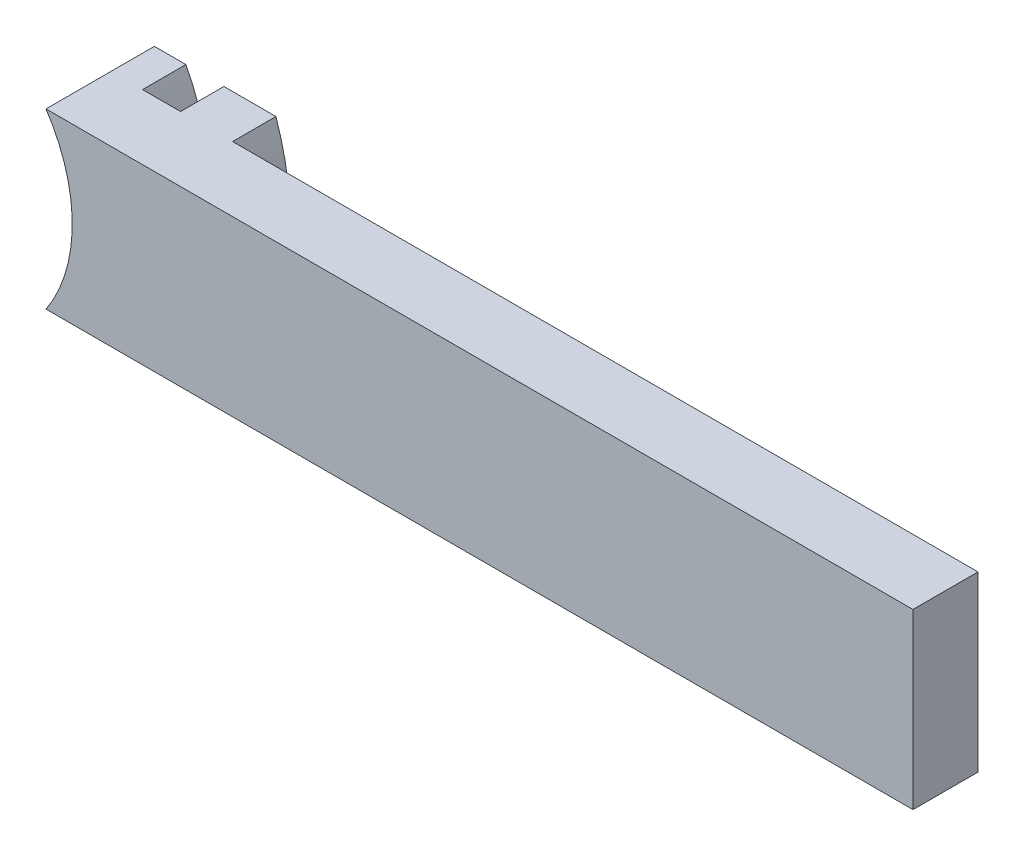
ISO-10303-21;
HEADER;
FILE_DESCRIPTION(('STEP AP214'),'2;1');
FILE_NAME('part.step','',(''),(''),'','','');
FILE_SCHEMA(('AUTOMOTIVE_DESIGN { 1 0 10303 214 1 1 1 1 }'));
ENDSEC;
DATA;
#1=APPLICATION_CONTEXT('core data for automotive mechanical design processes');
#2=APPLICATION_PROTOCOL_DEFINITION('international standard','automotive_design',2000,#1);
#3=PRODUCT_CONTEXT('',#1,'mechanical');
#4=PRODUCT('Part','Part','',(#3));
#5=PRODUCT_RELATED_PRODUCT_CATEGORY('part','',(#4));
#6=PRODUCT_DEFINITION_FORMATION('','',#4);
#7=PRODUCT_DEFINITION_CONTEXT('part definition',#1,'design');
#8=PRODUCT_DEFINITION('design','',#6,#7);
#9=PRODUCT_DEFINITION_SHAPE('','',#8);
#10=(LENGTH_UNIT() NAMED_UNIT(*) SI_UNIT(.MILLI.,.METRE.));
#11=(NAMED_UNIT(*) PLANE_ANGLE_UNIT() SI_UNIT($,.RADIAN.));
#12=(NAMED_UNIT(*) SI_UNIT($,.STERADIAN.) SOLID_ANGLE_UNIT());
#13=UNCERTAINTY_MEASURE_WITH_UNIT(LENGTH_MEASURE(1.E-05),#10,'distance_accuracy_value','');
#14=(GEOMETRIC_REPRESENTATION_CONTEXT(3) GLOBAL_UNCERTAINTY_ASSIGNED_CONTEXT((#13)) GLOBAL_UNIT_ASSIGNED_CONTEXT((#10,
#11,#12)) REPRESENTATION_CONTEXT('',''));
#15=CARTESIAN_POINT('',(0.,0.,0.));
#16=DIRECTION('',(0.,0.,1.));
#17=DIRECTION('',(1.,0.,0.));
#18=AXIS2_PLACEMENT_3D('',#15,#16,#17);
#19=CARTESIAN_POINT('',(0.,0.,-15.));
#20=DIRECTION('',(0.,0.,-1.));
#21=DIRECTION('',(-1.,0.,0.));
#22=AXIS2_PLACEMENT_3D('',#19,#20,#21);
#23=PLANE('',#22);
#24=CARTESIAN_POINT('',(0.,0.,-15.));
#25=DIRECTION('',(0.,0.,-1.));
#26=DIRECTION('',(1.,0.,0.));
#27=AXIS2_PLACEMENT_3D('',#24,#25,#26);
#28=CIRCLE('',#27,42.3);
#29=CARTESIAN_POINT('',(37.2731807067763,20.,-15.));
#30=VERTEX_POINT('',#29);
#31=CARTESIAN_POINT('',(37.2731807067763,-19.9999999999999,-15.));
#32=VERTEX_POINT('',#31);
#33=EDGE_CURVE('E61',#30,#32,#28,.T.);
#34=ORIENTED_EDGE('',*,*,#33,.F.);
#35=DIRECTION('',(-1.,0.,0.));
#36=VECTOR('',#35,1.);
#37=CARTESIAN_POINT('',(30.,20.,-15.));
#38=LINE('',#37,#36);
#39=CARTESIAN_POINT('',(46.0438921030792,20.,-15.));
#40=VERTEX_POINT('',#39);
#41=EDGE_CURVE('E178',#40,#30,#38,.T.);
#42=ORIENTED_EDGE('',*,*,#41,.F.);
#43=CARTESIAN_POINT('',(0.,0.,-15.));
#44=DIRECTION('',(0.,0.,1.));
#45=DIRECTION('',(1.,0.,0.));
#46=AXIS2_PLACEMENT_3D('',#43,#44,#45);
#47=CIRCLE('',#46,50.2);
#48=CARTESIAN_POINT('',(46.0438921030792,-20.,-15.));
#49=VERTEX_POINT('',#48);
#50=EDGE_CURVE('E56',#49,#40,#47,.T.);
#51=ORIENTED_EDGE('',*,*,#50,.F.);
#52=DIRECTION('',(1.,0.,0.));
#53=VECTOR('',#52,1.);
#54=CARTESIAN_POINT('',(30.,-20.,-15.));
#55=LINE('',#54,#53);
#56=EDGE_CURVE('E173',#32,#49,#55,.T.);
#57=ORIENTED_EDGE('',*,*,#56,.F.);
#58=EDGE_LOOP('',(#34,#42,#51,#57));
#59=FACE_BOUND('',#58,.T.);
#60=ADVANCED_FACE('F39',(#59),#23,.T.);
#61=CARTESIAN_POINT('',(0.,0.,-15.));
#62=DIRECTION('',(0.,0.,1.));
#63=DIRECTION('',(1.,0.,0.));
#64=AXIS2_PLACEMENT_3D('',#61,#62,#63);
#65=CYLINDRICAL_SURFACE('',#64,36.0555127546399);
#66=CARTESIAN_POINT('',(0.,0.,0.));
#67=DIRECTION('',(0.,0.,-1.));
#68=DIRECTION('',(-1.,0.,0.));
#69=AXIS2_PLACEMENT_3D('',#66,#67,#68);
#70=CIRCLE('',#69,36.0555127546399);
#71=CARTESIAN_POINT('',(30.,20.,0.));
#72=VERTEX_POINT('',#71);
#73=CARTESIAN_POINT('',(30.,-20.,0.));
#74=VERTEX_POINT('',#73);
#75=EDGE_CURVE('E120',#72,#74,#70,.T.);
#76=ORIENTED_EDGE('',*,*,#75,.F.);
#77=DIRECTION('',(0.,0.,1.));
#78=VECTOR('',#77,1.);
#79=CARTESIAN_POINT('',(30.,20.,-15.));
#80=LINE('',#79,#78);
#81=CARTESIAN_POINT('',(30.,20.,-25.));
#82=VERTEX_POINT('',#81);
#83=EDGE_CURVE('E11',#82,#72,#80,.T.);
#84=ORIENTED_EDGE('',*,*,#83,.F.);
#85=CARTESIAN_POINT('',(0.,0.,-25.));
#86=DIRECTION('',(0.,0.,1.));
#87=DIRECTION('',(-1.,0.,0.));
#88=AXIS2_PLACEMENT_3D('',#85,#86,#87);
#89=CIRCLE('',#88,36.0555127546399);
#90=CARTESIAN_POINT('',(30.0000000000001,-19.9999999999999,-25.));
#91=VERTEX_POINT('',#90);
#92=EDGE_CURVE('E118',#91,#82,#89,.T.);
#93=ORIENTED_EDGE('',*,*,#92,.F.);
#94=DIRECTION('',(0.,0.,1.));
#95=VECTOR('',#94,1.);
#96=CARTESIAN_POINT('',(30.,-20.,-15.));
#97=LINE('',#96,#95);
#98=EDGE_CURVE('E43',#91,#74,#97,.T.);
#99=ORIENTED_EDGE('',*,*,#98,.T.);
#100=EDGE_LOOP('',(#76,#84,#93,#99));
#101=FACE_BOUND('',#100,.T.);
#102=ADVANCED_FACE('F41',(#101),#65,.F.);
#103=CARTESIAN_POINT('',(30.,20.,-15.));
#104=DIRECTION('',(0.,1.,0.));
#105=DIRECTION('',(-1.,0.,0.));
#106=AXIS2_PLACEMENT_3D('',#103,#104,#105);
#107=PLANE('',#106);
#108=DIRECTION('',(-1.,0.,0.));
#109=VECTOR('',#108,1.);
#110=CARTESIAN_POINT('',(30.,20.,0.));
#111=LINE('',#110,#109);
#112=CARTESIAN_POINT('',(230.,20.,0.));
#113=VERTEX_POINT('',#112);
#114=EDGE_CURVE('E174',#113,#72,#111,.T.);
#115=ORIENTED_EDGE('',*,*,#114,.F.);
#116=DIRECTION('',(0.,0.,1.));
#117=VECTOR('',#116,1.);
#118=CARTESIAN_POINT('',(230.,20.,-15.));
#119=LINE('',#118,#117);
#120=CARTESIAN_POINT('',(230.,20.,-15.));
#121=VERTEX_POINT('',#120);
#122=EDGE_CURVE('E48',#121,#113,#119,.T.);
#123=ORIENTED_EDGE('',*,*,#122,.F.);
#124=CARTESIAN_POINT('',(58.0438921030792,20.,-15.));
#125=VERTEX_POINT('',#124);
#126=EDGE_CURVE('E179',#121,#125,#38,.T.);
#127=ORIENTED_EDGE('',*,*,#126,.T.);
#128=DIRECTION('',(0.,0.,1.));
#129=VECTOR('',#128,1.);
#130=CARTESIAN_POINT('',(58.0438921030793,19.9999999999998,-25.));
#131=LINE('',#130,#129);
#132=CARTESIAN_POINT('',(58.0438921030793,19.9999999999998,-25.));
#133=VERTEX_POINT('',#132);
#134=EDGE_CURVE('E149',#133,#125,#131,.T.);
#135=ORIENTED_EDGE('',*,*,#134,.F.);
#136=DIRECTION('',(1.,0.,0.));
#137=VECTOR('',#136,1.);
#138=CARTESIAN_POINT('',(46.0438921030793,19.9999999999998,-25.));
#139=LINE('',#138,#137);
#140=CARTESIAN_POINT('',(46.0438921030793,19.9999999999998,-25.));
#141=VERTEX_POINT('',#140);
#142=EDGE_CURVE('E167',#141,#133,#139,.T.);
#143=ORIENTED_EDGE('',*,*,#142,.F.);
#144=DIRECTION('',(0.,0.,1.));
#145=VECTOR('',#144,1.);
#146=CARTESIAN_POINT('',(46.0438921030793,19.9999999999998,-25.));
#147=LINE('',#146,#145);
#148=EDGE_CURVE('E146',#141,#40,#147,.T.);
#149=ORIENTED_EDGE('',*,*,#148,.T.);
#150=ORIENTED_EDGE('',*,*,#41,.T.);
#151=DIRECTION('',(0.,0.,1.));
#152=VECTOR('',#151,1.);
#153=CARTESIAN_POINT('',(37.2731807067763,20.,-25.));
#154=LINE('',#153,#152);
#155=CARTESIAN_POINT('',(37.2731807067763,20.,-25.));
#156=VERTEX_POINT('',#155);
#157=EDGE_CURVE('E128',#156,#30,#154,.T.);
#158=ORIENTED_EDGE('',*,*,#157,.F.);
#159=DIRECTION('',(1.,0.,0.));
#160=VECTOR('',#159,1.);
#161=CARTESIAN_POINT('',(37.2731807067763,20.,-25.));
#162=LINE('',#161,#160);
#163=EDGE_CURVE('E125',#82,#156,#162,.T.);
#164=ORIENTED_EDGE('',*,*,#163,.F.);
#165=ORIENTED_EDGE('',*,*,#83,.T.);
#166=EDGE_LOOP('',(#115,#123,#127,#135,#143,#149,#150,#158,#164,#165));
#167=FACE_BOUND('',#166,.T.);
#168=ADVANCED_FACE('F126',(#167),#107,.T.);
#169=CARTESIAN_POINT('',(230.,20.,-15.));
#170=DIRECTION('',(1.,0.,0.));
#171=DIRECTION('',(0.,0.,-1.));
#172=AXIS2_PLACEMENT_3D('',#169,#170,#171);
#173=PLANE('',#172);
#174=DIRECTION('',(0.,1.,0.));
#175=VECTOR('',#174,1.);
#176=CARTESIAN_POINT('',(230.,20.,0.));
#177=LINE('',#176,#175);
#178=CARTESIAN_POINT('',(230.,-20.,0.));
#179=VERTEX_POINT('',#178);
#180=EDGE_CURVE('E186',#179,#113,#177,.T.);
#181=ORIENTED_EDGE('',*,*,#180,.F.);
#182=DIRECTION('',(0.,0.,1.));
#183=VECTOR('',#182,1.);
#184=CARTESIAN_POINT('',(230.,-20.,-15.));
#185=LINE('',#184,#183);
#186=CARTESIAN_POINT('',(230.,-20.,-15.));
#187=VERTEX_POINT('',#186);
#188=EDGE_CURVE('E190',#187,#179,#185,.T.);
#189=ORIENTED_EDGE('',*,*,#188,.F.);
#190=DIRECTION('',(0.,1.,0.));
#191=VECTOR('',#190,1.);
#192=CARTESIAN_POINT('',(230.,20.,-15.));
#193=LINE('',#192,#191);
#194=EDGE_CURVE('E175',#187,#121,#193,.T.);
#195=ORIENTED_EDGE('',*,*,#194,.T.);
#196=ORIENTED_EDGE('',*,*,#122,.T.);
#197=EDGE_LOOP('',(#181,#189,#195,#196));
#198=FACE_BOUND('',#197,.T.);
#199=ADVANCED_FACE('F202',(#198),#173,.T.);
#200=CARTESIAN_POINT('',(30.,-20.,-15.));
#201=DIRECTION('',(0.,-1.,0.));
#202=DIRECTION('',(1.,0.,0.));
#203=AXIS2_PLACEMENT_3D('',#200,#201,#202);
#204=PLANE('',#203);
#205=DIRECTION('',(1.,0.,0.));
#206=VECTOR('',#205,1.);
#207=CARTESIAN_POINT('',(30.,-20.,0.));
#208=LINE('',#207,#206);
#209=EDGE_CURVE('E183',#74,#179,#208,.T.);
#210=ORIENTED_EDGE('',*,*,#209,.F.);
#211=ORIENTED_EDGE('',*,*,#98,.F.);
#212=DIRECTION('',(-1.,0.,0.));
#213=VECTOR('',#212,1.);
#214=CARTESIAN_POINT('',(37.2731807067763,-19.9999999999999,-25.));
#215=LINE('',#214,#213);
#216=CARTESIAN_POINT('',(37.2731807067763,-19.9999999999999,-25.));
#217=VERTEX_POINT('',#216);
#218=EDGE_CURVE('E136',#217,#91,#215,.T.);
#219=ORIENTED_EDGE('',*,*,#218,.F.);
#220=DIRECTION('',(0.,0.,1.));
#221=VECTOR('',#220,1.);
#222=CARTESIAN_POINT('',(37.2731807067763,-19.9999999999999,-25.));
#223=LINE('',#222,#221);
#224=EDGE_CURVE('E141',#217,#32,#223,.T.);
#225=ORIENTED_EDGE('',*,*,#224,.T.);
#226=ORIENTED_EDGE('',*,*,#56,.T.);
#227=DIRECTION('',(0.,0.,1.));
#228=VECTOR('',#227,1.);
#229=CARTESIAN_POINT('',(46.0438921030793,-19.9999999999998,-25.));
#230=LINE('',#229,#228);
#231=CARTESIAN_POINT('',(46.0438921030793,-19.9999999999998,-25.));
#232=VERTEX_POINT('',#231);
#233=EDGE_CURVE('E155',#232,#49,#230,.T.);
#234=ORIENTED_EDGE('',*,*,#233,.F.);
#235=DIRECTION('',(-1.,0.,0.));
#236=VECTOR('',#235,1.);
#237=CARTESIAN_POINT('',(46.0438921030793,-19.9999999999998,-25.));
#238=LINE('',#237,#236);
#239=CARTESIAN_POINT('',(58.0438921030793,-19.9999999999998,-25.));
#240=VERTEX_POINT('',#239);
#241=EDGE_CURVE('E158',#240,#232,#238,.T.);
#242=ORIENTED_EDGE('',*,*,#241,.F.);
#243=DIRECTION('',(0.,0.,1.));
#244=VECTOR('',#243,1.);
#245=CARTESIAN_POINT('',(58.0438921030793,-19.9999999999998,-25.));
#246=LINE('',#245,#244);
#247=CARTESIAN_POINT('',(58.0438921030793,-19.9999999999998,-15.));
#248=VERTEX_POINT('',#247);
#249=EDGE_CURVE('E152',#240,#248,#246,.T.);
#250=ORIENTED_EDGE('',*,*,#249,.T.);
#251=EDGE_CURVE('E171',#248,#187,#55,.T.);
#252=ORIENTED_EDGE('',*,*,#251,.T.);
#253=ORIENTED_EDGE('',*,*,#188,.T.);
#254=EDGE_LOOP('',(#210,#211,#219,#225,#226,#234,#242,#250,#252,#253));
#255=FACE_BOUND('',#254,.T.);
#256=ADVANCED_FACE('F195',(#255),#204,.T.);
#257=CARTESIAN_POINT('',(0.,0.,-15.));
#258=DIRECTION('',(0.,0.,-1.));
#259=DIRECTION('',(-1.,0.,0.));
#260=AXIS2_PLACEMENT_3D('',#257,#258,#259);
#261=CIRCLE('',#260,61.3929426764502);
#262=EDGE_CURVE('E159',#125,#248,#261,.T.);
#263=ORIENTED_EDGE('',*,*,#262,.F.);
#264=ORIENTED_EDGE('',*,*,#126,.F.);
#265=ORIENTED_EDGE('',*,*,#194,.F.);
#266=ORIENTED_EDGE('',*,*,#251,.F.);
#267=EDGE_LOOP('',(#263,#264,#265,#266));
#268=FACE_BOUND('',#267,.T.);
#269=ADVANCED_FACE('F204',(#268),#23,.T.);
#270=CARTESIAN_POINT('',(0.,0.,0.));
#271=DIRECTION('',(0.,0.,-1.));
#272=DIRECTION('',(-1.,0.,0.));
#273=AXIS2_PLACEMENT_3D('',#270,#271,#272);
#274=PLANE('',#273);
#275=ORIENTED_EDGE('',*,*,#75,.T.);
#276=ORIENTED_EDGE('',*,*,#209,.T.);
#277=ORIENTED_EDGE('',*,*,#180,.T.);
#278=ORIENTED_EDGE('',*,*,#114,.T.);
#279=EDGE_LOOP('',(#275,#276,#277,#278));
#280=FACE_BOUND('',#279,.T.);
#281=ADVANCED_FACE('F197',(#280),#274,.F.);
#282=CARTESIAN_POINT('',(0.,0.,-25.));
#283=DIRECTION('',(0.,0.,1.));
#284=DIRECTION('',(1.,0.,0.));
#285=AXIS2_PLACEMENT_3D('',#282,#283,#284);
#286=CYLINDRICAL_SURFACE('',#285,50.2);
#287=ORIENTED_EDGE('',*,*,#50,.T.);
#288=ORIENTED_EDGE('',*,*,#148,.F.);
#289=CARTESIAN_POINT('',(0.,0.,-25.));
#290=DIRECTION('',(0.,0.,1.));
#291=DIRECTION('',(1.,0.,0.));
#292=AXIS2_PLACEMENT_3D('',#289,#290,#291);
#293=CIRCLE('',#292,50.2);
#294=EDGE_CURVE('E162',#232,#141,#293,.T.);
#295=ORIENTED_EDGE('',*,*,#294,.F.);
#296=ORIENTED_EDGE('',*,*,#233,.T.);
#297=EDGE_LOOP('',(#287,#288,#295,#296));
#298=FACE_BOUND('',#297,.T.);
#299=ADVANCED_FACE('F216',(#298),#286,.F.);
#300=CARTESIAN_POINT('',(0.,0.,-25.));
#301=DIRECTION('',(0.,0.,1.));
#302=DIRECTION('',(1.,0.,0.));
#303=AXIS2_PLACEMENT_3D('',#300,#301,#302);
#304=CYLINDRICAL_SURFACE('',#303,61.3929426764502);
#305=ORIENTED_EDGE('',*,*,#262,.T.);
#306=ORIENTED_EDGE('',*,*,#249,.F.);
#307=CARTESIAN_POINT('',(0.,0.,-25.));
#308=DIRECTION('',(0.,0.,-1.));
#309=DIRECTION('',(-1.,0.,0.));
#310=AXIS2_PLACEMENT_3D('',#307,#308,#309);
#311=CIRCLE('',#310,61.3929426764502);
#312=EDGE_CURVE('E165',#133,#240,#311,.T.);
#313=ORIENTED_EDGE('',*,*,#312,.F.);
#314=ORIENTED_EDGE('',*,*,#134,.T.);
#315=EDGE_LOOP('',(#305,#306,#313,#314));
#316=FACE_BOUND('',#315,.T.);
#317=ADVANCED_FACE('F207',(#316),#304,.T.);
#318=CARTESIAN_POINT('',(0.,0.,-25.));
#319=DIRECTION('',(0.,0.,1.));
#320=DIRECTION('',(1.,0.,0.));
#321=AXIS2_PLACEMENT_3D('',#318,#319,#320);
#322=PLANE('',#321);
#323=ORIENTED_EDGE('',*,*,#294,.T.);
#324=ORIENTED_EDGE('',*,*,#142,.T.);
#325=ORIENTED_EDGE('',*,*,#312,.T.);
#326=ORIENTED_EDGE('',*,*,#241,.T.);
#327=EDGE_LOOP('',(#323,#324,#325,#326));
#328=FACE_BOUND('',#327,.T.);
#329=ADVANCED_FACE('F213',(#328),#322,.F.);
#330=CARTESIAN_POINT('',(0.,0.,-25.));
#331=DIRECTION('',(0.,0.,1.));
#332=DIRECTION('',(1.,0.,0.));
#333=AXIS2_PLACEMENT_3D('',#330,#331,#332);
#334=CYLINDRICAL_SURFACE('',#333,42.3);
#335=ORIENTED_EDGE('',*,*,#33,.T.);
#336=ORIENTED_EDGE('',*,*,#224,.F.);
#337=CARTESIAN_POINT('',(0.,0.,-25.));
#338=DIRECTION('',(0.,0.,-1.));
#339=DIRECTION('',(1.,0.,0.));
#340=AXIS2_PLACEMENT_3D('',#337,#338,#339);
#341=CIRCLE('',#340,42.3);
#342=EDGE_CURVE('E131',#156,#217,#341,.T.);
#343=ORIENTED_EDGE('',*,*,#342,.F.);
#344=ORIENTED_EDGE('',*,*,#157,.T.);
#345=EDGE_LOOP('',(#335,#336,#343,#344));
#346=FACE_BOUND('',#345,.T.);
#347=ADVANCED_FACE('F304',(#346),#334,.T.);
#348=CARTESIAN_POINT('',(0.,0.,-25.));
#349=DIRECTION('',(0.,0.,-1.));
#350=DIRECTION('',(-1.,0.,0.));
#351=AXIS2_PLACEMENT_3D('',#348,#349,#350);
#352=PLANE('',#351);
#353=ORIENTED_EDGE('',*,*,#92,.T.);
#354=ORIENTED_EDGE('',*,*,#163,.T.);
#355=ORIENTED_EDGE('',*,*,#342,.T.);
#356=ORIENTED_EDGE('',*,*,#218,.T.);
#357=EDGE_LOOP('',(#353,#354,#355,#356));
#358=FACE_BOUND('',#357,.T.);
#359=ADVANCED_FACE('F134',(#358),#352,.T.);
#360=CLOSED_SHELL('',(#60,#102,#168,#199,#256,#269,#281,#299,#317,#329,#347,#359));
#361=MANIFOLD_SOLID_BREP('B2',#360);
#362=ADVANCED_BREP_SHAPE_REPRESENTATION('',(#18,#361),#14);
#363=SHAPE_DEFINITION_REPRESENTATION(#9,#362);
ENDSEC;
END-ISO-10303-21;
